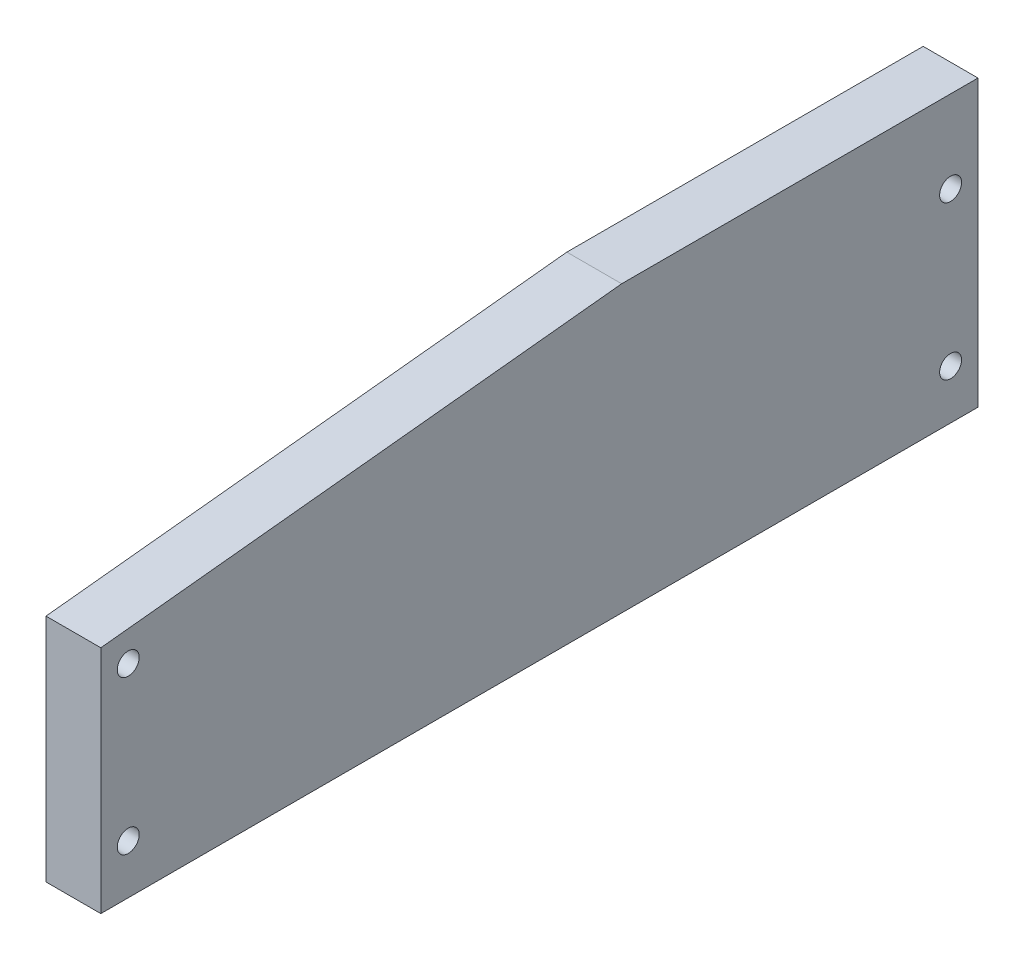
ISO-10303-21;
HEADER;
FILE_DESCRIPTION(('STEP AP214'),'2;1');
FILE_NAME('part.step','',(''),(''),'','','');
FILE_SCHEMA(('AUTOMOTIVE_DESIGN { 1 0 10303 214 1 1 1 1 }'));
ENDSEC;
DATA;
#1=APPLICATION_CONTEXT('core data for automotive mechanical design processes');
#2=APPLICATION_PROTOCOL_DEFINITION('international standard','automotive_design',2000,#1);
#3=PRODUCT_CONTEXT('',#1,'mechanical');
#4=PRODUCT('Part','Part','',(#3));
#5=PRODUCT_RELATED_PRODUCT_CATEGORY('part','',(#4));
#6=PRODUCT_DEFINITION_FORMATION('','',#4);
#7=PRODUCT_DEFINITION_CONTEXT('part definition',#1,'design');
#8=PRODUCT_DEFINITION('design','',#6,#7);
#9=PRODUCT_DEFINITION_SHAPE('','',#8);
#10=(LENGTH_UNIT() NAMED_UNIT(*) SI_UNIT(.MILLI.,.METRE.));
#11=(NAMED_UNIT(*) PLANE_ANGLE_UNIT() SI_UNIT($,.RADIAN.));
#12=(NAMED_UNIT(*) SI_UNIT($,.STERADIAN.) SOLID_ANGLE_UNIT());
#13=UNCERTAINTY_MEASURE_WITH_UNIT(LENGTH_MEASURE(1.E-05),#10,'distance_accuracy_value','');
#14=(GEOMETRIC_REPRESENTATION_CONTEXT(3) GLOBAL_UNCERTAINTY_ASSIGNED_CONTEXT((#13)) GLOBAL_UNIT_ASSIGNED_CONTEXT((#10,
#11,#12)) REPRESENTATION_CONTEXT('',''));
#15=CARTESIAN_POINT('',(0.,0.,0.));
#16=DIRECTION('',(0.,0.,1.));
#17=DIRECTION('',(1.,0.,0.));
#18=AXIS2_PLACEMENT_3D('',#15,#16,#17);
#19=CARTESIAN_POINT('',(10.,46.9577257605828,46.4056173280265));
#20=DIRECTION('',(0.,1.,0.));
#21=DIRECTION('',(0.,0.,1.));
#22=AXIS2_PLACEMENT_3D('',#19,#20,#21);
#23=PLANE('',#22);
#24=DIRECTION('',(0.,0.,-1.));
#25=VECTOR('',#24,1.);
#26=CARTESIAN_POINT('',(0.,46.9577257605828,46.4056173280265));
#27=LINE('',#26,#25);
#28=CARTESIAN_POINT('',(0.,46.9577257605828,46.4056173280265));
#29=VERTEX_POINT('',#28);
#30=CARTESIAN_POINT('',(0.,46.9577257605828,-18.5943826719735));
#31=VERTEX_POINT('',#30);
#32=EDGE_CURVE('E113',#29,#31,#27,.T.);
#33=ORIENTED_EDGE('',*,*,#32,.F.);
#34=DIRECTION('',(-1.,0.,0.));
#35=VECTOR('',#34,1.);
#36=CARTESIAN_POINT('',(10.,46.9577257605828,46.4056173280265));
#37=LINE('',#36,#35);
#38=CARTESIAN_POINT('',(10.,46.9577257605828,46.4056173280265));
#39=VERTEX_POINT('',#38);
#40=EDGE_CURVE('E11',#39,#29,#37,.T.);
#41=ORIENTED_EDGE('',*,*,#40,.F.);
#42=DIRECTION('',(0.,0.,-1.));
#43=VECTOR('',#42,1.);
#44=CARTESIAN_POINT('',(10.,46.9577257605828,46.4056173280265));
#45=LINE('',#44,#43);
#46=CARTESIAN_POINT('',(10.,46.9577257605828,-18.5943826719735));
#47=VERTEX_POINT('',#46);
#48=EDGE_CURVE('E108',#39,#47,#45,.T.);
#49=ORIENTED_EDGE('',*,*,#48,.T.);
#50=DIRECTION('',(-1.,0.,0.));
#51=VECTOR('',#50,1.);
#52=CARTESIAN_POINT('',(10.,46.9577257605828,-18.5943826719735));
#53=LINE('',#52,#51);
#54=EDGE_CURVE('E39',#47,#31,#53,.T.);
#55=ORIENTED_EDGE('',*,*,#54,.T.);
#56=EDGE_LOOP('',(#33,#41,#49,#55));
#57=FACE_BOUND('',#56,.T.);
#58=ADVANCED_FACE('F36',(#57),#23,.T.);
#59=CARTESIAN_POINT('',(10.,36.9577257605828,141.405617328026));
#60=DIRECTION('',(0.,0.994505452921406,0.104684784518043));
#61=DIRECTION('',(0.,-0.104684784518043,0.994505452921406));
#62=AXIS2_PLACEMENT_3D('',#59,#60,#61);
#63=PLANE('',#62);
#64=DIRECTION('',(0.,0.104684784518043,-0.994505452921406));
#65=VECTOR('',#64,1.);
#66=CARTESIAN_POINT('',(0.,36.9577257605828,141.405617328026));
#67=LINE('',#66,#65);
#68=CARTESIAN_POINT('',(0.,36.9577257605828,141.405617328026));
#69=VERTEX_POINT('',#68);
#70=EDGE_CURVE('E123',#69,#29,#67,.T.);
#71=ORIENTED_EDGE('',*,*,#70,.F.);
#72=DIRECTION('',(-1.,0.,0.));
#73=VECTOR('',#72,1.);
#74=CARTESIAN_POINT('',(10.,36.9577257605828,141.405617328026));
#75=LINE('',#74,#73);
#76=CARTESIAN_POINT('',(10.,36.9577257605828,141.405617328026));
#77=VERTEX_POINT('',#76);
#78=EDGE_CURVE('E45',#77,#69,#75,.T.);
#79=ORIENTED_EDGE('',*,*,#78,.F.);
#80=DIRECTION('',(0.,0.104684784518043,-0.994505452921406));
#81=VECTOR('',#80,1.);
#82=CARTESIAN_POINT('',(10.,36.9577257605828,141.405617328026));
#83=LINE('',#82,#81);
#84=EDGE_CURVE('E103',#77,#39,#83,.T.);
#85=ORIENTED_EDGE('',*,*,#84,.T.);
#86=ORIENTED_EDGE('',*,*,#40,.T.);
#87=EDGE_LOOP('',(#71,#79,#85,#86));
#88=FACE_BOUND('',#87,.T.);
#89=ADVANCED_FACE('F129',(#88),#63,.T.);
#90=CARTESIAN_POINT('',(10.,-5.04227423941725,141.405617328026));
#91=DIRECTION('',(0.,0.,1.));
#92=DIRECTION('',(1.,0.,0.));
#93=AXIS2_PLACEMENT_3D('',#90,#91,#92);
#94=PLANE('',#93);
#95=DIRECTION('',(0.,1.,0.));
#96=VECTOR('',#95,1.);
#97=CARTESIAN_POINT('',(0.,-5.04227423941725,141.405617328026));
#98=LINE('',#97,#96);
#99=CARTESIAN_POINT('',(0.,-5.04227423941725,141.405617328026));
#100=VERTEX_POINT('',#99);
#101=EDGE_CURVE('E92',#100,#69,#98,.T.);
#102=ORIENTED_EDGE('',*,*,#101,.F.);
#103=DIRECTION('',(-1.,0.,0.));
#104=VECTOR('',#103,1.);
#105=CARTESIAN_POINT('',(10.,-5.04227423941725,141.405617328026));
#106=LINE('',#105,#104);
#107=CARTESIAN_POINT('',(10.,-5.04227423941725,141.405617328026));
#108=VERTEX_POINT('',#107);
#109=EDGE_CURVE('E87',#108,#100,#106,.T.);
#110=ORIENTED_EDGE('',*,*,#109,.F.);
#111=DIRECTION('',(0.,1.,0.));
#112=VECTOR('',#111,1.);
#113=CARTESIAN_POINT('',(10.,-5.04227423941725,141.405617328026));
#114=LINE('',#113,#112);
#115=EDGE_CURVE('E90',#108,#77,#114,.T.);
#116=ORIENTED_EDGE('',*,*,#115,.T.);
#117=ORIENTED_EDGE('',*,*,#78,.T.);
#118=EDGE_LOOP('',(#102,#110,#116,#117));
#119=FACE_BOUND('',#118,.T.);
#120=ADVANCED_FACE('F89',(#119),#94,.T.);
#121=CARTESIAN_POINT('',(10.,-5.04227423941723,-18.5943826719735));
#122=DIRECTION('',(0.,-1.,0.));
#123=DIRECTION('',(0.,0.,-1.));
#124=AXIS2_PLACEMENT_3D('',#121,#122,#123);
#125=PLANE('',#124);
#126=DIRECTION('',(0.,0.,1.));
#127=VECTOR('',#126,1.);
#128=CARTESIAN_POINT('',(0.,-5.04227423941723,-18.5943826719735));
#129=LINE('',#128,#127);
#130=CARTESIAN_POINT('',(0.,-5.04227423941723,-18.5943826719735));
#131=VERTEX_POINT('',#130);
#132=EDGE_CURVE('E120',#131,#100,#129,.T.);
#133=ORIENTED_EDGE('',*,*,#132,.F.);
#134=DIRECTION('',(-1.,0.,0.));
#135=VECTOR('',#134,1.);
#136=CARTESIAN_POINT('',(10.,-5.04227423941723,-18.5943826719735));
#137=LINE('',#136,#135);
#138=CARTESIAN_POINT('',(10.,-5.04227423941723,-18.5943826719735));
#139=VERTEX_POINT('',#138);
#140=EDGE_CURVE('E97',#139,#131,#137,.T.);
#141=ORIENTED_EDGE('',*,*,#140,.F.);
#142=DIRECTION('',(0.,0.,1.));
#143=VECTOR('',#142,1.);
#144=CARTESIAN_POINT('',(10.,-5.04227423941723,-18.5943826719735));
#145=LINE('',#144,#143);
#146=EDGE_CURVE('E102',#139,#108,#145,.T.);
#147=ORIENTED_EDGE('',*,*,#146,.T.);
#148=ORIENTED_EDGE('',*,*,#109,.T.);
#149=EDGE_LOOP('',(#133,#141,#147,#148));
#150=FACE_BOUND('',#149,.T.);
#151=ADVANCED_FACE('F105',(#150),#125,.T.);
#152=CARTESIAN_POINT('',(10.,46.9577257605828,-18.5943826719735));
#153=DIRECTION('',(0.,0.,-1.));
#154=DIRECTION('',(0.,1.,0.));
#155=AXIS2_PLACEMENT_3D('',#152,#153,#154);
#156=PLANE('',#155);
#157=DIRECTION('',(0.,-1.,0.));
#158=VECTOR('',#157,1.);
#159=CARTESIAN_POINT('',(0.,46.9577257605828,-18.5943826719735));
#160=LINE('',#159,#158);
#161=EDGE_CURVE('E116',#31,#131,#160,.T.);
#162=ORIENTED_EDGE('',*,*,#161,.F.);
#163=ORIENTED_EDGE('',*,*,#54,.F.);
#164=DIRECTION('',(0.,-1.,0.));
#165=VECTOR('',#164,1.);
#166=CARTESIAN_POINT('',(10.,46.9577257605828,-18.5943826719735));
#167=LINE('',#166,#165);
#168=EDGE_CURVE('E106',#47,#139,#167,.T.);
#169=ORIENTED_EDGE('',*,*,#168,.T.);
#170=ORIENTED_EDGE('',*,*,#140,.T.);
#171=EDGE_LOOP('',(#162,#163,#169,#170));
#172=FACE_BOUND('',#171,.T.);
#173=ADVANCED_FACE('F126',(#172),#156,.T.);
#174=CARTESIAN_POINT('',(10.,0.,0.));
#175=DIRECTION('',(-1.,0.,0.));
#176=DIRECTION('',(0.,0.,1.));
#177=AXIS2_PLACEMENT_3D('',#174,#175,#176);
#178=PLANE('',#177);
#179=CARTESIAN_POINT('',(10.,31.9577257605828,-13.5943826719735));
#180=DIRECTION('',(1.,0.,0.));
#181=DIRECTION('',(0.,0.,-1.));
#182=AXIS2_PLACEMENT_3D('',#179,#180,#181);
#183=CIRCLE('',#182,2.);
#184=CARTESIAN_POINT('',(10.,31.9577257605828,-15.5943826719735));
#185=VERTEX_POINT('',#184);
#186=EDGE_CURVE('E205',#185,#185,#183,.T.);
#187=ORIENTED_EDGE('',*,*,#186,.F.);
#188=EDGE_LOOP('',(#187));
#189=FACE_BOUND('',#188,.T.);
#190=CARTESIAN_POINT('',(10.,3.95772576058277,-13.5943826719735));
#191=DIRECTION('',(1.,0.,0.));
#192=DIRECTION('',(0.,0.,-1.));
#193=AXIS2_PLACEMENT_3D('',#190,#191,#192);
#194=CIRCLE('',#193,2.);
#195=CARTESIAN_POINT('',(10.,3.95772576058277,-15.5943826719735));
#196=VERTEX_POINT('',#195);
#197=EDGE_CURVE('E199',#196,#196,#194,.T.);
#198=ORIENTED_EDGE('',*,*,#197,.F.);
#199=EDGE_LOOP('',(#198));
#200=FACE_BOUND('',#199,.T.);
#201=CARTESIAN_POINT('',(10.,3.95772576058277,136.405617328026));
#202=DIRECTION('',(1.,0.,0.));
#203=DIRECTION('',(0.,0.,-1.));
#204=AXIS2_PLACEMENT_3D('',#201,#202,#203);
#205=CIRCLE('',#204,2.);
#206=CARTESIAN_POINT('',(10.,3.95772576058277,134.405617328026));
#207=VERTEX_POINT('',#206);
#208=EDGE_CURVE('E189',#207,#207,#205,.T.);
#209=ORIENTED_EDGE('',*,*,#208,.F.);
#210=EDGE_LOOP('',(#209));
#211=FACE_BOUND('',#210,.T.);
#212=CARTESIAN_POINT('',(10.,31.9577257605828,136.405617328026));
#213=DIRECTION('',(1.,0.,0.));
#214=DIRECTION('',(0.,0.,-1.));
#215=AXIS2_PLACEMENT_3D('',#212,#213,#214);
#216=CIRCLE('',#215,2.);
#217=CARTESIAN_POINT('',(10.,31.9577257605828,134.405617328026));
#218=VERTEX_POINT('',#217);
#219=EDGE_CURVE('E188',#218,#218,#216,.T.);
#220=ORIENTED_EDGE('',*,*,#219,.F.);
#221=EDGE_LOOP('',(#220));
#222=FACE_BOUND('',#221,.T.);
#223=ORIENTED_EDGE('',*,*,#48,.F.);
#224=ORIENTED_EDGE('',*,*,#84,.F.);
#225=ORIENTED_EDGE('',*,*,#115,.F.);
#226=ORIENTED_EDGE('',*,*,#146,.F.);
#227=ORIENTED_EDGE('',*,*,#168,.F.);
#228=EDGE_LOOP('',(#223,#224,#225,#226,#227));
#229=FACE_BOUND('',#228,.T.);
#230=ADVANCED_FACE('F101',(#189,#200,#211,#222,#229),#178,.F.);
#231=CARTESIAN_POINT('',(0.,0.,0.));
#232=DIRECTION('',(-1.,0.,0.));
#233=DIRECTION('',(0.,0.,1.));
#234=AXIS2_PLACEMENT_3D('',#231,#232,#233);
#235=PLANE('',#234);
#236=ORIENTED_EDGE('',*,*,#32,.T.);
#237=ORIENTED_EDGE('',*,*,#161,.T.);
#238=ORIENTED_EDGE('',*,*,#132,.T.);
#239=ORIENTED_EDGE('',*,*,#101,.T.);
#240=ORIENTED_EDGE('',*,*,#70,.T.);
#241=EDGE_LOOP('',(#236,#237,#238,#239,#240));
#242=FACE_BOUND('',#241,.T.);
#243=ADVANCED_FACE('F128',(#242),#235,.T.);
#244=CARTESIAN_POINT('',(5.,31.9577257605828,136.405617328026));
#245=DIRECTION('',(1.,0.,0.));
#246=DIRECTION('',(0.,0.,-1.));
#247=AXIS2_PLACEMENT_3D('',#244,#245,#246);
#248=CYLINDRICAL_SURFACE('',#247,2.);
#249=CARTESIAN_POINT('',(5.,31.9577257605828,136.405617328026));
#250=DIRECTION('',(1.,0.,0.));
#251=DIRECTION('',(0.,0.,-1.));
#252=AXIS2_PLACEMENT_3D('',#249,#250,#251);
#253=CIRCLE('',#252,2.);
#254=CARTESIAN_POINT('',(5.,31.9577257605828,134.405617328026));
#255=VERTEX_POINT('',#254);
#256=EDGE_CURVE('E117',#255,#255,#253,.T.);
#257=ORIENTED_EDGE('',*,*,#256,.F.);
#258=EDGE_LOOP('',(#257));
#259=FACE_BOUND('',#258,.T.);
#260=ORIENTED_EDGE('',*,*,#219,.T.);
#261=EDGE_LOOP('',(#260));
#262=FACE_BOUND('',#261,.T.);
#263=ADVANCED_FACE('F149',(#259,#262),#248,.F.);
#264=CARTESIAN_POINT('',(5.,31.9577257605828,136.405617328026));
#265=DIRECTION('',(1.,0.,0.));
#266=DIRECTION('',(0.,0.,-1.));
#267=AXIS2_PLACEMENT_3D('',#264,#265,#266);
#268=PLANE('',#267);
#269=ORIENTED_EDGE('',*,*,#256,.T.);
#270=EDGE_LOOP('',(#269));
#271=FACE_BOUND('',#270,.T.);
#272=ADVANCED_FACE('F155',(#271),#268,.T.);
#273=CARTESIAN_POINT('',(5.,3.95772576058277,136.405617328026));
#274=DIRECTION('',(1.,0.,0.));
#275=DIRECTION('',(0.,0.,-1.));
#276=AXIS2_PLACEMENT_3D('',#273,#274,#275);
#277=CYLINDRICAL_SURFACE('',#276,2.);
#278=CARTESIAN_POINT('',(5.,3.95772576058277,136.405617328026));
#279=DIRECTION('',(1.,0.,0.));
#280=DIRECTION('',(0.,0.,-1.));
#281=AXIS2_PLACEMENT_3D('',#278,#279,#280);
#282=CIRCLE('',#281,2.);
#283=CARTESIAN_POINT('',(5.,3.95772576058277,134.405617328026));
#284=VERTEX_POINT('',#283);
#285=EDGE_CURVE('E187',#284,#284,#282,.T.);
#286=ORIENTED_EDGE('',*,*,#285,.F.);
#287=EDGE_LOOP('',(#286));
#288=FACE_BOUND('',#287,.T.);
#289=ORIENTED_EDGE('',*,*,#208,.T.);
#290=EDGE_LOOP('',(#289));
#291=FACE_BOUND('',#290,.T.);
#292=ADVANCED_FACE('F159',(#288,#291),#277,.F.);
#293=CARTESIAN_POINT('',(5.,3.95772576058277,136.405617328026));
#294=DIRECTION('',(1.,0.,0.));
#295=DIRECTION('',(0.,0.,-1.));
#296=AXIS2_PLACEMENT_3D('',#293,#294,#295);
#297=PLANE('',#296);
#298=ORIENTED_EDGE('',*,*,#285,.T.);
#299=EDGE_LOOP('',(#298));
#300=FACE_BOUND('',#299,.T.);
#301=ADVANCED_FACE('F173',(#300),#297,.T.);
#302=CARTESIAN_POINT('',(5.,3.95772576058277,-13.5943826719735));
#303=DIRECTION('',(1.,0.,0.));
#304=DIRECTION('',(0.,0.,-1.));
#305=AXIS2_PLACEMENT_3D('',#302,#303,#304);
#306=CYLINDRICAL_SURFACE('',#305,2.);
#307=CARTESIAN_POINT('',(5.,3.95772576058277,-13.5943826719735));
#308=DIRECTION('',(1.,0.,0.));
#309=DIRECTION('',(0.,0.,-1.));
#310=AXIS2_PLACEMENT_3D('',#307,#308,#309);
#311=CIRCLE('',#310,2.);
#312=CARTESIAN_POINT('',(5.,3.95772576058277,-15.5943826719735));
#313=VERTEX_POINT('',#312);
#314=EDGE_CURVE('E194',#313,#313,#311,.T.);
#315=ORIENTED_EDGE('',*,*,#314,.F.);
#316=EDGE_LOOP('',(#315));
#317=FACE_BOUND('',#316,.T.);
#318=ORIENTED_EDGE('',*,*,#197,.T.);
#319=EDGE_LOOP('',(#318));
#320=FACE_BOUND('',#319,.T.);
#321=ADVANCED_FACE('F170',(#317,#320),#306,.F.);
#322=CARTESIAN_POINT('',(5.,3.95772576058277,-13.5943826719735));
#323=DIRECTION('',(1.,0.,0.));
#324=DIRECTION('',(0.,0.,-1.));
#325=AXIS2_PLACEMENT_3D('',#322,#323,#324);
#326=PLANE('',#325);
#327=ORIENTED_EDGE('',*,*,#314,.T.);
#328=EDGE_LOOP('',(#327));
#329=FACE_BOUND('',#328,.T.);
#330=ADVANCED_FACE('F165',(#329),#326,.T.);
#331=CARTESIAN_POINT('',(5.,31.9577257605828,-13.5943826719735));
#332=DIRECTION('',(1.,0.,0.));
#333=DIRECTION('',(0.,0.,-1.));
#334=AXIS2_PLACEMENT_3D('',#331,#332,#333);
#335=CYLINDRICAL_SURFACE('',#334,2.);
#336=CARTESIAN_POINT('',(5.,31.9577257605828,-13.5943826719735));
#337=DIRECTION('',(1.,0.,0.));
#338=DIRECTION('',(0.,0.,-1.));
#339=AXIS2_PLACEMENT_3D('',#336,#337,#338);
#340=CIRCLE('',#339,2.);
#341=CARTESIAN_POINT('',(5.,31.9577257605828,-15.5943826719735));
#342=VERTEX_POINT('',#341);
#343=EDGE_CURVE('E202',#342,#342,#340,.T.);
#344=ORIENTED_EDGE('',*,*,#343,.F.);
#345=EDGE_LOOP('',(#344));
#346=FACE_BOUND('',#345,.T.);
#347=ORIENTED_EDGE('',*,*,#186,.T.);
#348=EDGE_LOOP('',(#347));
#349=FACE_BOUND('',#348,.T.);
#350=ADVANCED_FACE('F161',(#346,#349),#335,.F.);
#351=CARTESIAN_POINT('',(5.,31.9577257605828,-13.5943826719735));
#352=DIRECTION('',(1.,0.,0.));
#353=DIRECTION('',(0.,0.,-1.));
#354=AXIS2_PLACEMENT_3D('',#351,#352,#353);
#355=PLANE('',#354);
#356=ORIENTED_EDGE('',*,*,#343,.T.);
#357=EDGE_LOOP('',(#356));
#358=FACE_BOUND('',#357,.T.);
#359=ADVANCED_FACE('F164',(#358),#355,.T.);
#360=CLOSED_SHELL('',(#58,#89,#120,#151,#173,#230,#243,#263,#272,#292,#301,#321,#330,#350,#359));
#361=MANIFOLD_SOLID_BREP('B2',#360);
#362=ADVANCED_BREP_SHAPE_REPRESENTATION('',(#18,#361),#14);
#363=SHAPE_DEFINITION_REPRESENTATION(#9,#362);
ENDSEC;
END-ISO-10303-21;
